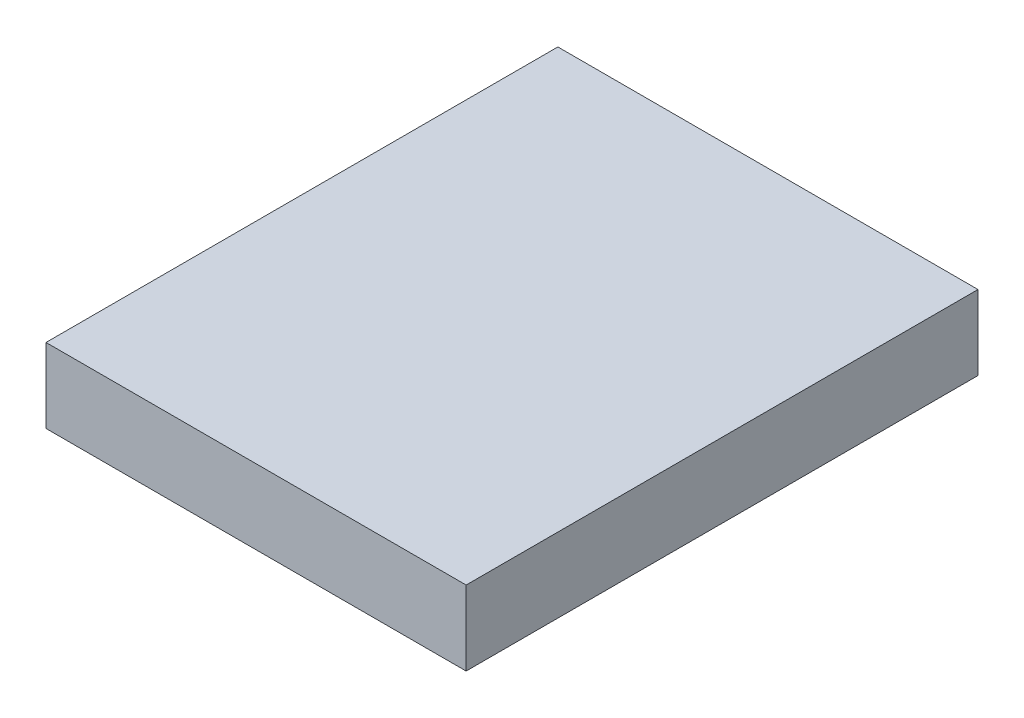
ISO-10303-21;
HEADER;
FILE_DESCRIPTION(('STEP AP214'),'2;1');
FILE_NAME('part.step','',(''),(''),'','','');
FILE_SCHEMA(('AUTOMOTIVE_DESIGN { 1 0 10303 214 1 1 1 1 }'));
ENDSEC;
DATA;
#1=APPLICATION_CONTEXT('core data for automotive mechanical design processes');
#2=APPLICATION_PROTOCOL_DEFINITION('international standard','automotive_design',2000,#1);
#3=PRODUCT_CONTEXT('',#1,'mechanical');
#4=PRODUCT('Part','Part','',(#3));
#5=PRODUCT_RELATED_PRODUCT_CATEGORY('part','',(#4));
#6=PRODUCT_DEFINITION_FORMATION('','',#4);
#7=PRODUCT_DEFINITION_CONTEXT('part definition',#1,'design');
#8=PRODUCT_DEFINITION('design','',#6,#7);
#9=PRODUCT_DEFINITION_SHAPE('','',#8);
#10=(LENGTH_UNIT() NAMED_UNIT(*) SI_UNIT(.MILLI.,.METRE.));
#11=(NAMED_UNIT(*) PLANE_ANGLE_UNIT() SI_UNIT($,.RADIAN.));
#12=(NAMED_UNIT(*) SI_UNIT($,.STERADIAN.) SOLID_ANGLE_UNIT());
#13=UNCERTAINTY_MEASURE_WITH_UNIT(LENGTH_MEASURE(1.E-05),#10,'distance_accuracy_value','');
#14=(GEOMETRIC_REPRESENTATION_CONTEXT(3) GLOBAL_UNCERTAINTY_ASSIGNED_CONTEXT((#13)) GLOBAL_UNIT_ASSIGNED_CONTEXT((#10,
#11,#12)) REPRESENTATION_CONTEXT('',''));
#15=CARTESIAN_POINT('',(0.,0.,0.));
#16=DIRECTION('',(0.,0.,1.));
#17=DIRECTION('',(1.,0.,0.));
#18=AXIS2_PLACEMENT_3D('',#15,#16,#17);
#19=CARTESIAN_POINT('',(0.,0.,446.46));
#20=DIRECTION('',(1.,0.,0.));
#21=DIRECTION('',(0.,1.,0.));
#22=AXIS2_PLACEMENT_3D('',#19,#20,#21);
#23=PLANE('',#22);
#24=DIRECTION('',(0.,-1.,0.));
#25=VECTOR('',#24,1.);
#26=CARTESIAN_POINT('',(0.,0.,0.));
#27=LINE('',#26,#25);
#28=CARTESIAN_POINT('',(0.,65.,0.));
#29=VERTEX_POINT('',#28);
#30=CARTESIAN_POINT('',(0.,0.,0.));
#31=VERTEX_POINT('',#30);
#32=EDGE_CURVE('E98',#29,#31,#27,.T.);
#33=ORIENTED_EDGE('',*,*,#32,.T.);
#34=DIRECTION('',(0.,0.,-1.));
#35=VECTOR('',#34,1.);
#36=CARTESIAN_POINT('',(0.,0.,446.46));
#37=LINE('',#36,#35);
#38=CARTESIAN_POINT('',(0.,0.,446.46));
#39=VERTEX_POINT('',#38);
#40=EDGE_CURVE('E11',#39,#31,#37,.T.);
#41=ORIENTED_EDGE('',*,*,#40,.F.);
#42=DIRECTION('',(0.,-1.,0.));
#43=VECTOR('',#42,1.);
#44=CARTESIAN_POINT('',(0.,0.,446.46));
#45=LINE('',#44,#43);
#46=CARTESIAN_POINT('',(0.,65.,446.46));
#47=VERTEX_POINT('',#46);
#48=EDGE_CURVE('E86',#47,#39,#45,.T.);
#49=ORIENTED_EDGE('',*,*,#48,.F.);
#50=DIRECTION('',(0.,0.,-1.));
#51=VECTOR('',#50,1.);
#52=CARTESIAN_POINT('',(0.,65.,446.46));
#53=LINE('',#52,#51);
#54=EDGE_CURVE('E94',#47,#29,#53,.T.);
#55=ORIENTED_EDGE('',*,*,#54,.T.);
#56=EDGE_LOOP('',(#33,#41,#49,#55));
#57=FACE_BOUND('',#56,.T.);
#58=ADVANCED_FACE('F35',(#57),#23,.F.);
#59=CARTESIAN_POINT('',(0.,0.,446.46));
#60=DIRECTION('',(0.,1.,0.));
#61=DIRECTION('',(0.,0.,1.));
#62=AXIS2_PLACEMENT_3D('',#59,#60,#61);
#63=PLANE('',#62);
#64=DIRECTION('',(1.,0.,0.));
#65=VECTOR('',#64,1.);
#66=CARTESIAN_POINT('',(0.,0.,0.));
#67=LINE('',#66,#65);
#68=CARTESIAN_POINT('',(366.46,0.,0.));
#69=VERTEX_POINT('',#68);
#70=EDGE_CURVE('E90',#31,#69,#67,.T.);
#71=ORIENTED_EDGE('',*,*,#70,.T.);
#72=DIRECTION('',(0.,0.,-1.));
#73=VECTOR('',#72,1.);
#74=CARTESIAN_POINT('',(366.46,0.,446.46));
#75=LINE('',#74,#73);
#76=CARTESIAN_POINT('',(366.46,0.,446.46));
#77=VERTEX_POINT('',#76);
#78=EDGE_CURVE('E43',#77,#69,#75,.T.);
#79=ORIENTED_EDGE('',*,*,#78,.F.);
#80=DIRECTION('',(1.,0.,0.));
#81=VECTOR('',#80,1.);
#82=CARTESIAN_POINT('',(0.,0.,446.46));
#83=LINE('',#82,#81);
#84=EDGE_CURVE('E81',#39,#77,#83,.T.);
#85=ORIENTED_EDGE('',*,*,#84,.F.);
#86=ORIENTED_EDGE('',*,*,#40,.T.);
#87=EDGE_LOOP('',(#71,#79,#85,#86));
#88=FACE_BOUND('',#87,.T.);
#89=ADVANCED_FACE('F89',(#88),#63,.F.);
#90=CARTESIAN_POINT('',(366.46,0.,446.46));
#91=DIRECTION('',(-1.,0.,0.));
#92=DIRECTION('',(0.,0.,1.));
#93=AXIS2_PLACEMENT_3D('',#90,#91,#92);
#94=PLANE('',#93);
#95=DIRECTION('',(0.,1.,0.));
#96=VECTOR('',#95,1.);
#97=CARTESIAN_POINT('',(366.46,0.,0.));
#98=LINE('',#97,#96);
#99=CARTESIAN_POINT('',(366.46,65.,0.));
#100=VERTEX_POINT('',#99);
#101=EDGE_CURVE('E68',#69,#100,#98,.T.);
#102=ORIENTED_EDGE('',*,*,#101,.T.);
#103=DIRECTION('',(0.,0.,-1.));
#104=VECTOR('',#103,1.);
#105=CARTESIAN_POINT('',(366.46,65.,446.46));
#106=LINE('',#105,#104);
#107=CARTESIAN_POINT('',(366.46,65.,446.46));
#108=VERTEX_POINT('',#107);
#109=EDGE_CURVE('E91',#108,#100,#106,.T.);
#110=ORIENTED_EDGE('',*,*,#109,.F.);
#111=DIRECTION('',(0.,1.,0.));
#112=VECTOR('',#111,1.);
#113=CARTESIAN_POINT('',(366.46,0.,446.46));
#114=LINE('',#113,#112);
#115=EDGE_CURVE('E84',#77,#108,#114,.T.);
#116=ORIENTED_EDGE('',*,*,#115,.F.);
#117=ORIENTED_EDGE('',*,*,#78,.T.);
#118=EDGE_LOOP('',(#102,#110,#116,#117));
#119=FACE_BOUND('',#118,.T.);
#120=ADVANCED_FACE('F92',(#119),#94,.F.);
#121=CARTESIAN_POINT('',(0.,65.,446.46));
#122=DIRECTION('',(0.,-1.,0.));
#123=DIRECTION('',(0.,0.,-1.));
#124=AXIS2_PLACEMENT_3D('',#121,#122,#123);
#125=PLANE('',#124);
#126=DIRECTION('',(-1.,0.,0.));
#127=VECTOR('',#126,1.);
#128=CARTESIAN_POINT('',(0.,65.,0.));
#129=LINE('',#128,#127);
#130=EDGE_CURVE('E74',#100,#29,#129,.T.);
#131=ORIENTED_EDGE('',*,*,#130,.T.);
#132=ORIENTED_EDGE('',*,*,#54,.F.);
#133=DIRECTION('',(-1.,0.,0.));
#134=VECTOR('',#133,1.);
#135=CARTESIAN_POINT('',(0.,65.,446.46));
#136=LINE('',#135,#134);
#137=EDGE_CURVE('E51',#108,#47,#136,.T.);
#138=ORIENTED_EDGE('',*,*,#137,.F.);
#139=ORIENTED_EDGE('',*,*,#109,.T.);
#140=EDGE_LOOP('',(#131,#132,#138,#139));
#141=FACE_BOUND('',#140,.T.);
#142=ADVANCED_FACE('F105',(#141),#125,.F.);
#143=CARTESIAN_POINT('',(0.,0.,446.46));
#144=DIRECTION('',(0.,0.,-1.));
#145=DIRECTION('',(-1.,0.,0.));
#146=AXIS2_PLACEMENT_3D('',#143,#144,#145);
#147=PLANE('',#146);
#148=ORIENTED_EDGE('',*,*,#48,.T.);
#149=ORIENTED_EDGE('',*,*,#84,.T.);
#150=ORIENTED_EDGE('',*,*,#115,.T.);
#151=ORIENTED_EDGE('',*,*,#137,.T.);
#152=EDGE_LOOP('',(#148,#149,#150,#151));
#153=FACE_BOUND('',#152,.T.);
#154=ADVANCED_FACE('F82',(#153),#147,.F.);
#155=CARTESIAN_POINT('',(0.,0.,0.));
#156=DIRECTION('',(0.,0.,-1.));
#157=DIRECTION('',(-1.,0.,0.));
#158=AXIS2_PLACEMENT_3D('',#155,#156,#157);
#159=PLANE('',#158);
#160=ORIENTED_EDGE('',*,*,#32,.F.);
#161=ORIENTED_EDGE('',*,*,#130,.F.);
#162=ORIENTED_EDGE('',*,*,#101,.F.);
#163=ORIENTED_EDGE('',*,*,#70,.F.);
#164=EDGE_LOOP('',(#160,#161,#162,#163));
#165=FACE_BOUND('',#164,.T.);
#166=ADVANCED_FACE('F108',(#165),#159,.T.);
#167=CLOSED_SHELL('',(#58,#89,#120,#142,#154,#166));
#168=MANIFOLD_SOLID_BREP('B2',#167);
#169=ADVANCED_BREP_SHAPE_REPRESENTATION('',(#18,#168),#14);
#170=SHAPE_DEFINITION_REPRESENTATION(#9,#169);
ENDSEC;
END-ISO-10303-21;
